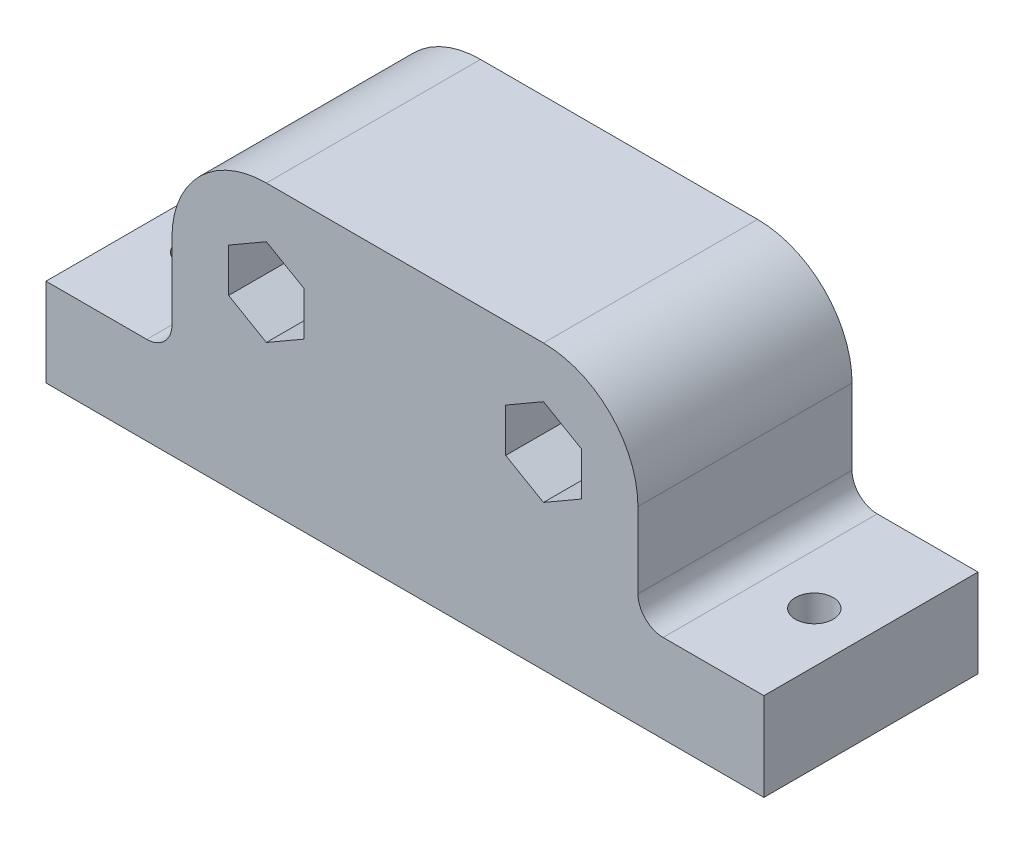
ISO-10303-21;
HEADER;
FILE_DESCRIPTION(('STEP AP214'),'2;1');
FILE_NAME('part.step','',(''),(''),'','','');
FILE_SCHEMA(('AUTOMOTIVE_DESIGN { 1 0 10303 214 1 1 1 1 }'));
ENDSEC;
DATA;
#1=APPLICATION_CONTEXT('core data for automotive mechanical design processes');
#2=APPLICATION_PROTOCOL_DEFINITION('international standard','automotive_design',2000,#1);
#3=PRODUCT_CONTEXT('',#1,'mechanical');
#4=PRODUCT('Part','Part','',(#3));
#5=PRODUCT_RELATED_PRODUCT_CATEGORY('part','',(#4));
#6=PRODUCT_DEFINITION_FORMATION('','',#4);
#7=PRODUCT_DEFINITION_CONTEXT('part definition',#1,'design');
#8=PRODUCT_DEFINITION('design','',#6,#7);
#9=PRODUCT_DEFINITION_SHAPE('','',#8);
#10=(LENGTH_UNIT() NAMED_UNIT(*) SI_UNIT(.MILLI.,.METRE.));
#11=(NAMED_UNIT(*) PLANE_ANGLE_UNIT() SI_UNIT($,.RADIAN.));
#12=(NAMED_UNIT(*) SI_UNIT($,.STERADIAN.) SOLID_ANGLE_UNIT());
#13=UNCERTAINTY_MEASURE_WITH_UNIT(LENGTH_MEASURE(1.E-05),#10,'distance_accuracy_value','');
#14=(GEOMETRIC_REPRESENTATION_CONTEXT(3) GLOBAL_UNCERTAINTY_ASSIGNED_CONTEXT((#13)) GLOBAL_UNIT_ASSIGNED_CONTEXT((#10,
#11,#12)) REPRESENTATION_CONTEXT('',''));
#15=CARTESIAN_POINT('',(0.,0.,0.));
#16=DIRECTION('',(0.,0.,1.));
#17=DIRECTION('',(1.,0.,0.));
#18=AXIS2_PLACEMENT_3D('',#15,#16,#17);
#19=CARTESIAN_POINT('',(6.99999999999999,12.1243556529821,15.));
#20=DIRECTION('',(-0.5,-0.866025403784439,0.));
#21=DIRECTION('',(0.866025403784439,-0.5,0.));
#22=AXIS2_PLACEMENT_3D('',#19,#20,#21);
#23=PLANE('',#22);
#24=DIRECTION('',(-0.866025403784439,0.5,0.));
#25=VECTOR('',#24,1.);
#26=CARTESIAN_POINT('',(6.99999999999999,12.1243556529821,0.));
#27=LINE('',#26,#25);
#28=CARTESIAN_POINT('',(25.,1.73205080756888,0.));
#29=VERTEX_POINT('',#28);
#30=CARTESIAN_POINT('',(22.,3.46410161513776,0.));
#31=VERTEX_POINT('',#30);
#32=EDGE_CURVE('E332',#29,#31,#27,.T.);
#33=ORIENTED_EDGE('',*,*,#32,.F.);
#34=DIRECTION('',(0.,0.,-1.));
#35=VECTOR('',#34,1.);
#36=CARTESIAN_POINT('',(25.,1.73205080756888,15.));
#37=LINE('',#36,#35);
#38=CARTESIAN_POINT('',(25.,1.73205080756888,15.));
#39=VERTEX_POINT('',#38);
#40=EDGE_CURVE('E361',#39,#29,#37,.T.);
#41=ORIENTED_EDGE('',*,*,#40,.F.);
#42=DIRECTION('',(-0.866025403784439,0.5,0.));
#43=VECTOR('',#42,1.);
#44=CARTESIAN_POINT('',(6.99999999999999,12.1243556529821,15.));
#45=LINE('',#44,#43);
#46=CARTESIAN_POINT('',(22.,3.46410161513776,15.));
#47=VERTEX_POINT('',#46);
#48=EDGE_CURVE('E297',#39,#47,#45,.T.);
#49=ORIENTED_EDGE('',*,*,#48,.T.);
#50=DIRECTION('',(0.,0.,-1.));
#51=VECTOR('',#50,1.);
#52=CARTESIAN_POINT('',(22.,3.46410161513776,15.));
#53=LINE('',#52,#51);
#54=EDGE_CURVE('E349',#47,#31,#53,.T.);
#55=ORIENTED_EDGE('',*,*,#54,.T.);
#56=EDGE_LOOP('',(#33,#41,#49,#55));
#57=FACE_BOUND('',#56,.T.);
#58=ADVANCED_FACE('F35',(#57),#23,.T.);
#59=CARTESIAN_POINT('',(25.,0.,15.));
#60=DIRECTION('',(-1.,0.,0.));
#61=DIRECTION('',(0.,-1.,0.));
#62=AXIS2_PLACEMENT_3D('',#59,#60,#61);
#63=PLANE('',#62);
#64=DIRECTION('',(0.,1.,0.));
#65=VECTOR('',#64,1.);
#66=CARTESIAN_POINT('',(25.,0.,0.));
#67=LINE('',#66,#65);
#68=CARTESIAN_POINT('',(25.,-1.73205080756888,0.));
#69=VERTEX_POINT('',#68);
#70=EDGE_CURVE('E335',#69,#29,#67,.T.);
#71=ORIENTED_EDGE('',*,*,#70,.F.);
#72=DIRECTION('',(0.,0.,-1.));
#73=VECTOR('',#72,1.);
#74=CARTESIAN_POINT('',(25.,-1.73205080756888,15.));
#75=LINE('',#74,#73);
#76=CARTESIAN_POINT('',(25.,-1.73205080756888,15.));
#77=VERTEX_POINT('',#76);
#78=EDGE_CURVE('E359',#77,#69,#75,.T.);
#79=ORIENTED_EDGE('',*,*,#78,.F.);
#80=DIRECTION('',(0.,1.,0.));
#81=VECTOR('',#80,1.);
#82=CARTESIAN_POINT('',(25.,0.,15.));
#83=LINE('',#82,#81);
#84=EDGE_CURVE('E300',#77,#39,#83,.T.);
#85=ORIENTED_EDGE('',*,*,#84,.T.);
#86=ORIENTED_EDGE('',*,*,#40,.T.);
#87=EDGE_LOOP('',(#71,#79,#85,#86));
#88=FACE_BOUND('',#87,.T.);
#89=ADVANCED_FACE('F445',(#88),#63,.T.);
#90=CARTESIAN_POINT('',(6.99999999999999,-12.1243556529821,15.));
#91=DIRECTION('',(-0.5,0.866025403784439,0.));
#92=DIRECTION('',(-0.866025403784439,-0.5,0.));
#93=AXIS2_PLACEMENT_3D('',#90,#91,#92);
#94=PLANE('',#93);
#95=DIRECTION('',(0.866025403784439,0.5,0.));
#96=VECTOR('',#95,1.);
#97=CARTESIAN_POINT('',(6.99999999999999,-12.1243556529821,0.));
#98=LINE('',#97,#96);
#99=CARTESIAN_POINT('',(22.,-3.46410161513776,0.));
#100=VERTEX_POINT('',#99);
#101=EDGE_CURVE('E338',#100,#69,#98,.T.);
#102=ORIENTED_EDGE('',*,*,#101,.F.);
#103=DIRECTION('',(0.,0.,-1.));
#104=VECTOR('',#103,1.);
#105=CARTESIAN_POINT('',(22.,-3.46410161513776,15.));
#106=LINE('',#105,#104);
#107=CARTESIAN_POINT('',(22.,-3.46410161513776,15.));
#108=VERTEX_POINT('',#107);
#109=EDGE_CURVE('E357',#108,#100,#106,.T.);
#110=ORIENTED_EDGE('',*,*,#109,.F.);
#111=DIRECTION('',(0.866025403784439,0.5,0.));
#112=VECTOR('',#111,1.);
#113=CARTESIAN_POINT('',(6.99999999999999,-12.1243556529821,15.));
#114=LINE('',#113,#112);
#115=EDGE_CURVE('E303',#108,#77,#114,.T.);
#116=ORIENTED_EDGE('',*,*,#115,.T.);
#117=ORIENTED_EDGE('',*,*,#78,.T.);
#118=EDGE_LOOP('',(#102,#110,#116,#117));
#119=FACE_BOUND('',#118,.T.);
#120=ADVANCED_FACE('F451',(#119),#94,.T.);
#121=CARTESIAN_POINT('',(4.,6.92820323027551,15.));
#122=DIRECTION('',(0.5,0.866025403784439,0.));
#123=DIRECTION('',(-0.866025403784439,0.5,0.));
#124=AXIS2_PLACEMENT_3D('',#121,#122,#123);
#125=PLANE('',#124);
#126=DIRECTION('',(0.866025403784439,-0.5,0.));
#127=VECTOR('',#126,1.);
#128=CARTESIAN_POINT('',(4.,6.92820323027551,0.));
#129=LINE('',#128,#127);
#130=CARTESIAN_POINT('',(19.,-1.73205080756888,0.));
#131=VERTEX_POINT('',#130);
#132=EDGE_CURVE('E341',#131,#100,#129,.T.);
#133=ORIENTED_EDGE('',*,*,#132,.F.);
#134=DIRECTION('',(0.,0.,-1.));
#135=VECTOR('',#134,1.);
#136=CARTESIAN_POINT('',(19.,-1.73205080756888,15.));
#137=LINE('',#136,#135);
#138=CARTESIAN_POINT('',(19.,-1.73205080756888,15.));
#139=VERTEX_POINT('',#138);
#140=EDGE_CURVE('E355',#139,#131,#137,.T.);
#141=ORIENTED_EDGE('',*,*,#140,.F.);
#142=DIRECTION('',(0.866025403784439,-0.5,0.));
#143=VECTOR('',#142,1.);
#144=CARTESIAN_POINT('',(4.,6.92820323027551,15.));
#145=LINE('',#144,#143);
#146=EDGE_CURVE('E306',#139,#108,#145,.T.);
#147=ORIENTED_EDGE('',*,*,#146,.T.);
#148=ORIENTED_EDGE('',*,*,#109,.T.);
#149=EDGE_LOOP('',(#133,#141,#147,#148));
#150=FACE_BOUND('',#149,.T.);
#151=ADVANCED_FACE('F537',(#150),#125,.T.);
#152=CARTESIAN_POINT('',(19.,0.,15.));
#153=DIRECTION('',(1.,0.,0.));
#154=DIRECTION('',(0.,0.,-1.));
#155=AXIS2_PLACEMENT_3D('',#152,#153,#154);
#156=PLANE('',#155);
#157=DIRECTION('',(0.,-1.,0.));
#158=VECTOR('',#157,1.);
#159=CARTESIAN_POINT('',(19.,0.,0.));
#160=LINE('',#159,#158);
#161=CARTESIAN_POINT('',(19.,1.73205080756888,0.));
#162=VERTEX_POINT('',#161);
#163=EDGE_CURVE('E344',#162,#131,#160,.T.);
#164=ORIENTED_EDGE('',*,*,#163,.F.);
#165=DIRECTION('',(0.,0.,-1.));
#166=VECTOR('',#165,1.);
#167=CARTESIAN_POINT('',(19.,1.73205080756888,15.));
#168=LINE('',#167,#166);
#169=CARTESIAN_POINT('',(19.,1.73205080756888,15.));
#170=VERTEX_POINT('',#169);
#171=EDGE_CURVE('E351',#170,#162,#168,.T.);
#172=ORIENTED_EDGE('',*,*,#171,.F.);
#173=DIRECTION('',(0.,-1.,0.));
#174=VECTOR('',#173,1.);
#175=CARTESIAN_POINT('',(19.,0.,15.));
#176=LINE('',#175,#174);
#177=EDGE_CURVE('E309',#170,#139,#176,.T.);
#178=ORIENTED_EDGE('',*,*,#177,.T.);
#179=ORIENTED_EDGE('',*,*,#140,.T.);
#180=EDGE_LOOP('',(#164,#172,#178,#179));
#181=FACE_BOUND('',#180,.T.);
#182=ADVANCED_FACE('F475',(#181),#156,.T.);
#183=CARTESIAN_POINT('',(1.5,2.59807621135332,15.));
#184=DIRECTION('',(-0.5,-0.866025403784439,0.));
#185=DIRECTION('',(0.866025403784439,-0.5,0.));
#186=AXIS2_PLACEMENT_3D('',#183,#184,#185);
#187=PLANE('',#186);
#188=DIRECTION('',(-0.866025403784439,0.5,0.));
#189=VECTOR('',#188,1.);
#190=CARTESIAN_POINT('',(1.5,2.59807621135332,0.));
#191=LINE('',#190,#189);
#192=CARTESIAN_POINT('',(3.,1.73205080756888,0.));
#193=VERTEX_POINT('',#192);
#194=CARTESIAN_POINT('',(0.,3.46410161513776,0.));
#195=VERTEX_POINT('',#194);
#196=EDGE_CURVE('E255',#193,#195,#191,.T.);
#197=ORIENTED_EDGE('',*,*,#196,.F.);
#198=DIRECTION('',(0.,0.,-1.));
#199=VECTOR('',#198,1.);
#200=CARTESIAN_POINT('',(3.,1.73205080756888,15.));
#201=LINE('',#200,#199);
#202=CARTESIAN_POINT('',(3.,1.73205080756888,15.));
#203=VERTEX_POINT('',#202);
#204=EDGE_CURVE('E352',#203,#193,#201,.T.);
#205=ORIENTED_EDGE('',*,*,#204,.F.);
#206=DIRECTION('',(-0.866025403784439,0.5,0.));
#207=VECTOR('',#206,1.);
#208=CARTESIAN_POINT('',(1.5,2.59807621135332,15.));
#209=LINE('',#208,#207);
#210=CARTESIAN_POINT('',(0.,3.46410161513776,15.));
#211=VERTEX_POINT('',#210);
#212=EDGE_CURVE('E279',#203,#211,#209,.T.);
#213=ORIENTED_EDGE('',*,*,#212,.T.);
#214=DIRECTION('',(0.,0.,-1.));
#215=VECTOR('',#214,1.);
#216=CARTESIAN_POINT('',(0.,3.46410161513776,15.));
#217=LINE('',#216,#215);
#218=EDGE_CURVE('E363',#211,#195,#217,.T.);
#219=ORIENTED_EDGE('',*,*,#218,.T.);
#220=EDGE_LOOP('',(#197,#205,#213,#219));
#221=FACE_BOUND('',#220,.T.);
#222=ADVANCED_FACE('F472',(#221),#187,.T.);
#223=CARTESIAN_POINT('',(3.,0.,15.));
#224=DIRECTION('',(-1.,0.,0.));
#225=DIRECTION('',(0.,0.,1.));
#226=AXIS2_PLACEMENT_3D('',#223,#224,#225);
#227=PLANE('',#226);
#228=DIRECTION('',(0.,1.,0.));
#229=VECTOR('',#228,1.);
#230=CARTESIAN_POINT('',(3.,0.,0.));
#231=LINE('',#230,#229);
#232=CARTESIAN_POINT('',(3.,-1.73205080756888,0.));
#233=VERTEX_POINT('',#232);
#234=EDGE_CURVE('E317',#233,#193,#231,.T.);
#235=ORIENTED_EDGE('',*,*,#234,.F.);
#236=DIRECTION('',(0.,0.,-1.));
#237=VECTOR('',#236,1.);
#238=CARTESIAN_POINT('',(3.,-1.73205080756888,15.));
#239=LINE('',#238,#237);
#240=CARTESIAN_POINT('',(3.,-1.73205080756888,15.));
#241=VERTEX_POINT('',#240);
#242=EDGE_CURVE('E373',#241,#233,#239,.T.);
#243=ORIENTED_EDGE('',*,*,#242,.F.);
#244=DIRECTION('',(0.,1.,0.));
#245=VECTOR('',#244,1.);
#246=CARTESIAN_POINT('',(3.,0.,15.));
#247=LINE('',#246,#245);
#248=EDGE_CURVE('E282',#241,#203,#247,.T.);
#249=ORIENTED_EDGE('',*,*,#248,.T.);
#250=ORIENTED_EDGE('',*,*,#204,.T.);
#251=EDGE_LOOP('',(#235,#243,#249,#250));
#252=FACE_BOUND('',#251,.T.);
#253=ADVANCED_FACE('F468',(#252),#227,.T.);
#254=CARTESIAN_POINT('',(1.5,-2.59807621135332,15.));
#255=DIRECTION('',(-0.5,0.866025403784439,0.));
#256=DIRECTION('',(-0.866025403784439,-0.5,0.));
#257=AXIS2_PLACEMENT_3D('',#254,#255,#256);
#258=PLANE('',#257);
#259=DIRECTION('',(0.866025403784439,0.5,0.));
#260=VECTOR('',#259,1.);
#261=CARTESIAN_POINT('',(1.5,-2.59807621135332,0.));
#262=LINE('',#261,#260);
#263=CARTESIAN_POINT('',(0.,-3.46410161513776,0.));
#264=VERTEX_POINT('',#263);
#265=EDGE_CURVE('E320',#264,#233,#262,.T.);
#266=ORIENTED_EDGE('',*,*,#265,.F.);
#267=DIRECTION('',(0.,0.,-1.));
#268=VECTOR('',#267,1.);
#269=CARTESIAN_POINT('',(0.,-3.46410161513776,15.));
#270=LINE('',#269,#268);
#271=CARTESIAN_POINT('',(0.,-3.46410161513776,15.));
#272=VERTEX_POINT('',#271);
#273=EDGE_CURVE('E371',#272,#264,#270,.T.);
#274=ORIENTED_EDGE('',*,*,#273,.F.);
#275=DIRECTION('',(0.866025403784439,0.5,0.));
#276=VECTOR('',#275,1.);
#277=CARTESIAN_POINT('',(1.5,-2.59807621135332,15.));
#278=LINE('',#277,#276);
#279=EDGE_CURVE('E285',#272,#241,#278,.T.);
#280=ORIENTED_EDGE('',*,*,#279,.T.);
#281=ORIENTED_EDGE('',*,*,#242,.T.);
#282=EDGE_LOOP('',(#266,#274,#280,#281));
#283=FACE_BOUND('',#282,.T.);
#284=ADVANCED_FACE('F464',(#283),#258,.T.);
#285=CARTESIAN_POINT('',(-1.5,-2.59807621135332,15.));
#286=DIRECTION('',(0.5,0.866025403784439,0.));
#287=DIRECTION('',(-0.866025403784439,0.5,0.));
#288=AXIS2_PLACEMENT_3D('',#285,#286,#287);
#289=PLANE('',#288);
#290=DIRECTION('',(0.866025403784439,-0.5,0.));
#291=VECTOR('',#290,1.);
#292=CARTESIAN_POINT('',(-1.5,-2.59807621135332,0.));
#293=LINE('',#292,#291);
#294=CARTESIAN_POINT('',(-3.,-1.73205080756888,0.));
#295=VERTEX_POINT('',#294);
#296=EDGE_CURVE('E323',#295,#264,#293,.T.);
#297=ORIENTED_EDGE('',*,*,#296,.F.);
#298=DIRECTION('',(0.,0.,-1.));
#299=VECTOR('',#298,1.);
#300=CARTESIAN_POINT('',(-3.,-1.73205080756888,15.));
#301=LINE('',#300,#299);
#302=CARTESIAN_POINT('',(-3.,-1.73205080756888,15.));
#303=VERTEX_POINT('',#302);
#304=EDGE_CURVE('E369',#303,#295,#301,.T.);
#305=ORIENTED_EDGE('',*,*,#304,.F.);
#306=DIRECTION('',(0.866025403784439,-0.5,0.));
#307=VECTOR('',#306,1.);
#308=CARTESIAN_POINT('',(-1.5,-2.59807621135332,15.));
#309=LINE('',#308,#307);
#310=EDGE_CURVE('E288',#303,#272,#309,.T.);
#311=ORIENTED_EDGE('',*,*,#310,.T.);
#312=ORIENTED_EDGE('',*,*,#273,.T.);
#313=EDGE_LOOP('',(#297,#305,#311,#312));
#314=FACE_BOUND('',#313,.T.);
#315=ADVANCED_FACE('F460',(#314),#289,.T.);
#316=CARTESIAN_POINT('',(-3.,0.,15.));
#317=DIRECTION('',(1.,0.,0.));
#318=DIRECTION('',(0.,0.,-1.));
#319=AXIS2_PLACEMENT_3D('',#316,#317,#318);
#320=PLANE('',#319);
#321=DIRECTION('',(0.,-1.,0.));
#322=VECTOR('',#321,1.);
#323=CARTESIAN_POINT('',(-3.,0.,0.));
#324=LINE('',#323,#322);
#325=CARTESIAN_POINT('',(-3.,1.73205080756888,0.));
#326=VERTEX_POINT('',#325);
#327=EDGE_CURVE('E326',#326,#295,#324,.T.);
#328=ORIENTED_EDGE('',*,*,#327,.F.);
#329=DIRECTION('',(0.,0.,-1.));
#330=VECTOR('',#329,1.);
#331=CARTESIAN_POINT('',(-3.,1.73205080756888,15.));
#332=LINE('',#331,#330);
#333=CARTESIAN_POINT('',(-3.,1.73205080756888,15.));
#334=VERTEX_POINT('',#333);
#335=EDGE_CURVE('E365',#334,#326,#332,.T.);
#336=ORIENTED_EDGE('',*,*,#335,.F.);
#337=DIRECTION('',(0.,-1.,0.));
#338=VECTOR('',#337,1.);
#339=CARTESIAN_POINT('',(-3.,0.,15.));
#340=LINE('',#339,#338);
#341=EDGE_CURVE('E291',#334,#303,#340,.T.);
#342=ORIENTED_EDGE('',*,*,#341,.T.);
#343=ORIENTED_EDGE('',*,*,#304,.T.);
#344=EDGE_LOOP('',(#328,#336,#342,#343));
#345=FACE_BOUND('',#344,.T.);
#346=ADVANCED_FACE('F457',(#345),#320,.T.);
#347=CARTESIAN_POINT('',(29.5,0.,15.));
#348=DIRECTION('',(1.,0.,0.));
#349=DIRECTION('',(0.,0.,-1.));
#350=AXIS2_PLACEMENT_3D('',#347,#348,#349);
#351=PLANE('',#350);
#352=DIRECTION('',(0.,-1.,0.));
#353=VECTOR('',#352,1.);
#354=CARTESIAN_POINT('',(29.5,0.,15.));
#355=LINE('',#354,#353);
#356=CARTESIAN_POINT('',(29.5,0.,15.));
#357=VERTEX_POINT('',#356);
#358=CARTESIAN_POINT('',(29.5,-6.,15.));
#359=VERTEX_POINT('',#358);
#360=EDGE_CURVE('E256',#357,#359,#355,.T.);
#361=ORIENTED_EDGE('',*,*,#360,.T.);
#362=DIRECTION('',(0.,0.,-1.));
#363=VECTOR('',#362,1.);
#364=CARTESIAN_POINT('',(29.5,-6.,15.));
#365=LINE('',#364,#363);
#366=CARTESIAN_POINT('',(29.5,-6.,-2.));
#367=VERTEX_POINT('',#366);
#368=EDGE_CURVE('E205',#359,#367,#365,.T.);
#369=ORIENTED_EDGE('',*,*,#368,.T.);
#370=DIRECTION('',(0.,-1.,0.));
#371=VECTOR('',#370,1.);
#372=CARTESIAN_POINT('',(29.5,0.,-2.));
#373=LINE('',#372,#371);
#374=CARTESIAN_POINT('',(29.5,0.,-2.));
#375=VERTEX_POINT('',#374);
#376=EDGE_CURVE('E222',#375,#367,#373,.T.);
#377=ORIENTED_EDGE('',*,*,#376,.F.);
#378=DIRECTION('',(0.,0.,-1.));
#379=VECTOR('',#378,1.);
#380=CARTESIAN_POINT('',(29.5,0.,15.));
#381=LINE('',#380,#379);
#382=EDGE_CURVE('E366',#357,#375,#381,.T.);
#383=ORIENTED_EDGE('',*,*,#382,.F.);
#384=EDGE_LOOP('',(#361,#369,#377,#383));
#385=FACE_BOUND('',#384,.T.);
#386=ADVANCED_FACE('F396',(#385),#351,.T.);
#387=CARTESIAN_POINT('',(22.,0.,15.));
#388=DIRECTION('',(0.,0.,-1.));
#389=DIRECTION('',(-1.,0.,0.));
#390=AXIS2_PLACEMENT_3D('',#387,#388,#389);
#391=CYLINDRICAL_SURFACE('',#390,7.5);
#392=ORIENTED_EDGE('',*,*,#382,.T.);
#393=CARTESIAN_POINT('',(22.,0.,-2.));
#394=DIRECTION('',(0.,0.,-1.));
#395=DIRECTION('',(-1.,0.,0.));
#396=AXIS2_PLACEMENT_3D('',#393,#394,#395);
#397=CIRCLE('',#396,7.5);
#398=CARTESIAN_POINT('',(22.,7.5,-2.));
#399=VERTEX_POINT('',#398);
#400=EDGE_CURVE('E252',#399,#375,#397,.T.);
#401=ORIENTED_EDGE('',*,*,#400,.F.);
#402=DIRECTION('',(0.,0.,-1.));
#403=VECTOR('',#402,1.);
#404=CARTESIAN_POINT('',(22.,7.5,15.));
#405=LINE('',#404,#403);
#406=CARTESIAN_POINT('',(22.,7.5,15.));
#407=VERTEX_POINT('',#406);
#408=EDGE_CURVE('E387',#407,#399,#405,.T.);
#409=ORIENTED_EDGE('',*,*,#408,.F.);
#410=CARTESIAN_POINT('',(22.,0.,15.));
#411=DIRECTION('',(0.,0.,1.));
#412=DIRECTION('',(1.,0.,0.));
#413=AXIS2_PLACEMENT_3D('',#410,#411,#412);
#414=CIRCLE('',#413,7.5);
#415=EDGE_CURVE('E259',#357,#407,#414,.T.);
#416=ORIENTED_EDGE('',*,*,#415,.F.);
#417=EDGE_LOOP('',(#392,#401,#409,#416));
#418=FACE_BOUND('',#417,.T.);
#419=ADVANCED_FACE('F401',(#418),#391,.T.);
#420=CARTESIAN_POINT('',(0.,7.5,15.));
#421=DIRECTION('',(0.,1.,0.));
#422=DIRECTION('',(-1.,0.,0.));
#423=AXIS2_PLACEMENT_3D('',#420,#421,#422);
#424=PLANE('',#423);
#425=ORIENTED_EDGE('',*,*,#408,.T.);
#426=DIRECTION('',(1.,0.,0.));
#427=VECTOR('',#426,1.);
#428=CARTESIAN_POINT('',(0.,7.5,-2.));
#429=LINE('',#428,#427);
#430=CARTESIAN_POINT('',(0.,7.5,-2.));
#431=VERTEX_POINT('',#430);
#432=EDGE_CURVE('E249',#431,#399,#429,.T.);
#433=ORIENTED_EDGE('',*,*,#432,.F.);
#434=DIRECTION('',(0.,0.,-1.));
#435=VECTOR('',#434,1.);
#436=CARTESIAN_POINT('',(0.,7.5,15.));
#437=LINE('',#436,#435);
#438=CARTESIAN_POINT('',(0.,7.5,15.));
#439=VERTEX_POINT('',#438);
#440=EDGE_CURVE('E385',#439,#431,#437,.T.);
#441=ORIENTED_EDGE('',*,*,#440,.F.);
#442=DIRECTION('',(1.,0.,0.));
#443=VECTOR('',#442,1.);
#444=CARTESIAN_POINT('',(0.,7.5,15.));
#445=LINE('',#444,#443);
#446=EDGE_CURVE('E262',#439,#407,#445,.T.);
#447=ORIENTED_EDGE('',*,*,#446,.T.);
#448=EDGE_LOOP('',(#425,#433,#441,#447));
#449=FACE_BOUND('',#448,.T.);
#450=ADVANCED_FACE('F406',(#449),#424,.T.);
#451=CARTESIAN_POINT('',(0.,0.,15.));
#452=DIRECTION('',(0.,0.,-1.));
#453=DIRECTION('',(-1.,0.,0.));
#454=AXIS2_PLACEMENT_3D('',#451,#452,#453);
#455=CYLINDRICAL_SURFACE('',#454,7.5);
#456=ORIENTED_EDGE('',*,*,#440,.T.);
#457=CARTESIAN_POINT('',(0.,0.,-2.));
#458=DIRECTION('',(0.,0.,-1.));
#459=DIRECTION('',(-1.,0.,0.));
#460=AXIS2_PLACEMENT_3D('',#457,#458,#459);
#461=CIRCLE('',#460,7.5);
#462=CARTESIAN_POINT('',(-7.5,0.,-2.));
#463=VERTEX_POINT('',#462);
#464=EDGE_CURVE('E246',#463,#431,#461,.T.);
#465=ORIENTED_EDGE('',*,*,#464,.F.);
#466=DIRECTION('',(0.,0.,-1.));
#467=VECTOR('',#466,1.);
#468=CARTESIAN_POINT('',(-7.5,0.,15.));
#469=LINE('',#468,#467);
#470=CARTESIAN_POINT('',(-7.5,0.,15.));
#471=VERTEX_POINT('',#470);
#472=EDGE_CURVE('E383',#471,#463,#469,.T.);
#473=ORIENTED_EDGE('',*,*,#472,.F.);
#474=CARTESIAN_POINT('',(0.,0.,15.));
#475=DIRECTION('',(0.,0.,1.));
#476=DIRECTION('',(1.,0.,0.));
#477=AXIS2_PLACEMENT_3D('',#474,#475,#476);
#478=CIRCLE('',#477,7.5);
#479=EDGE_CURVE('E265',#439,#471,#478,.T.);
#480=ORIENTED_EDGE('',*,*,#479,.F.);
#481=EDGE_LOOP('',(#456,#465,#473,#480));
#482=FACE_BOUND('',#481,.T.);
#483=ADVANCED_FACE('F410',(#482),#455,.T.);
#484=CARTESIAN_POINT('',(-7.5,0.,15.));
#485=DIRECTION('',(1.,0.,0.));
#486=DIRECTION('',(0.,1.,0.));
#487=AXIS2_PLACEMENT_3D('',#484,#485,#486);
#488=PLANE('',#487);
#489=ORIENTED_EDGE('',*,*,#472,.T.);
#490=DIRECTION('',(0.,1.,0.));
#491=VECTOR('',#490,1.);
#492=CARTESIAN_POINT('',(-7.5,-6.,-2.));
#493=LINE('',#492,#491);
#494=CARTESIAN_POINT('',(-7.5,-6.,-2.));
#495=VERTEX_POINT('',#494);
#496=EDGE_CURVE('E243',#495,#463,#493,.T.);
#497=ORIENTED_EDGE('',*,*,#496,.F.);
#498=DIRECTION('',(0.,0.,-1.));
#499=VECTOR('',#498,1.);
#500=CARTESIAN_POINT('',(-7.5,-6.,15.));
#501=LINE('',#500,#499);
#502=CARTESIAN_POINT('',(-7.5,-6.,15.));
#503=VERTEX_POINT('',#502);
#504=EDGE_CURVE('E50',#495,#503,#501,.F.);
#505=ORIENTED_EDGE('',*,*,#504,.T.);
#506=DIRECTION('',(0.,-1.,0.));
#507=VECTOR('',#506,1.);
#508=CARTESIAN_POINT('',(-7.5,0.,15.));
#509=LINE('',#508,#507);
#510=EDGE_CURVE('E267',#471,#503,#509,.T.);
#511=ORIENTED_EDGE('',*,*,#510,.F.);
#512=EDGE_LOOP('',(#489,#497,#505,#511));
#513=FACE_BOUND('',#512,.T.);
#514=ADVANCED_FACE('F411',(#513),#488,.F.);
#515=CARTESIAN_POINT('',(0.,-8.,15.));
#516=DIRECTION('',(0.,-1.,0.));
#517=DIRECTION('',(1.,0.,0.));
#518=AXIS2_PLACEMENT_3D('',#515,#516,#517);
#519=PLANE('',#518);
#520=CARTESIAN_POINT('',(-13.5,-8.,7.));
#521=DIRECTION('',(0.,1.,0.));
#522=DIRECTION('',(-1.,0.,0.));
#523=AXIS2_PLACEMENT_3D('',#520,#521,#522);
#524=CIRCLE('',#523,1.5);
#525=CARTESIAN_POINT('',(-15.,-8.,7.));
#526=VERTEX_POINT('',#525);
#527=EDGE_CURVE('E492',#526,#526,#524,.T.);
#528=ORIENTED_EDGE('',*,*,#527,.F.);
#529=EDGE_LOOP('',(#528));
#530=FACE_BOUND('',#529,.T.);
#531=DIRECTION('',(-1.,0.,0.));
#532=VECTOR('',#531,1.);
#533=CARTESIAN_POINT('',(0.,-8.,15.));
#534=LINE('',#533,#532);
#535=CARTESIAN_POINT('',(-9.5,-8.,15.));
#536=VERTEX_POINT('',#535);
#537=CARTESIAN_POINT('',(-17.5,-8.,15.));
#538=VERTEX_POINT('',#537);
#539=EDGE_CURVE('E269',#536,#538,#534,.T.);
#540=ORIENTED_EDGE('',*,*,#539,.F.);
#541=DIRECTION('',(0.,0.,-1.));
#542=VECTOR('',#541,1.);
#543=CARTESIAN_POINT('',(-9.5,-8.,0.));
#544=LINE('',#543,#542);
#545=CARTESIAN_POINT('',(-9.5,-8.,-2.));
#546=VERTEX_POINT('',#545);
#547=EDGE_CURVE('E204',#536,#546,#544,.T.);
#548=ORIENTED_EDGE('',*,*,#547,.T.);
#549=DIRECTION('',(1.,0.,0.));
#550=VECTOR('',#549,1.);
#551=CARTESIAN_POINT('',(-17.5,-8.,-2.));
#552=LINE('',#551,#550);
#553=CARTESIAN_POINT('',(-17.5,-8.,-2.));
#554=VERTEX_POINT('',#553);
#555=EDGE_CURVE('E237',#554,#546,#552,.T.);
#556=ORIENTED_EDGE('',*,*,#555,.F.);
#557=DIRECTION('',(0.,0.,-1.));
#558=VECTOR('',#557,1.);
#559=CARTESIAN_POINT('',(-17.5,-8.,15.));
#560=LINE('',#559,#558);
#561=EDGE_CURVE('E381',#538,#554,#560,.T.);
#562=ORIENTED_EDGE('',*,*,#561,.F.);
#563=EDGE_LOOP('',(#540,#548,#556,#562));
#564=FACE_BOUND('',#563,.T.);
#565=ADVANCED_FACE('F417',(#530,#564),#519,.F.);
#566=CARTESIAN_POINT('',(-17.5,0.,15.));
#567=DIRECTION('',(1.,0.,0.));
#568=DIRECTION('',(0.,0.,-1.));
#569=AXIS2_PLACEMENT_3D('',#566,#567,#568);
#570=PLANE('',#569);
#571=ORIENTED_EDGE('',*,*,#561,.T.);
#572=DIRECTION('',(0.,1.,0.));
#573=VECTOR('',#572,1.);
#574=CARTESIAN_POINT('',(-17.5,-15.,-2.));
#575=LINE('',#574,#573);
#576=CARTESIAN_POINT('',(-17.5,-15.,-2.));
#577=VERTEX_POINT('',#576);
#578=EDGE_CURVE('E234',#577,#554,#575,.T.);
#579=ORIENTED_EDGE('',*,*,#578,.F.);
#580=DIRECTION('',(0.,0.,-1.));
#581=VECTOR('',#580,1.);
#582=CARTESIAN_POINT('',(-17.5,-15.,15.));
#583=LINE('',#582,#581);
#584=CARTESIAN_POINT('',(-17.5,-15.,15.));
#585=VERTEX_POINT('',#584);
#586=EDGE_CURVE('E379',#585,#577,#583,.T.);
#587=ORIENTED_EDGE('',*,*,#586,.F.);
#588=DIRECTION('',(0.,-1.,0.));
#589=VECTOR('',#588,1.);
#590=CARTESIAN_POINT('',(-17.5,0.,15.));
#591=LINE('',#590,#589);
#592=EDGE_CURVE('E271',#538,#585,#591,.T.);
#593=ORIENTED_EDGE('',*,*,#592,.F.);
#594=EDGE_LOOP('',(#571,#579,#587,#593));
#595=FACE_BOUND('',#594,.T.);
#596=ADVANCED_FACE('F423',(#595),#570,.F.);
#597=CARTESIAN_POINT('',(0.,-15.,15.));
#598=DIRECTION('',(0.,1.,0.));
#599=DIRECTION('',(0.,0.,1.));
#600=AXIS2_PLACEMENT_3D('',#597,#598,#599);
#601=PLANE('',#600);
#602=CARTESIAN_POINT('',(35.5,-15.,7.));
#603=DIRECTION('',(0.,1.,0.));
#604=DIRECTION('',(-1.,0.,0.));
#605=AXIS2_PLACEMENT_3D('',#602,#603,#604);
#606=CIRCLE('',#605,1.5);
#607=CARTESIAN_POINT('',(34.,-15.,7.));
#608=VERTEX_POINT('',#607);
#609=EDGE_CURVE('E489',#608,#608,#606,.T.);
#610=ORIENTED_EDGE('',*,*,#609,.T.);
#611=EDGE_LOOP('',(#610));
#612=FACE_BOUND('',#611,.T.);
#613=CARTESIAN_POINT('',(-13.5,-15.,7.));
#614=DIRECTION('',(0.,1.,0.));
#615=DIRECTION('',(-1.,0.,0.));
#616=AXIS2_PLACEMENT_3D('',#613,#614,#615);
#617=CIRCLE('',#616,1.5);
#618=CARTESIAN_POINT('',(-15.,-15.,7.));
#619=VERTEX_POINT('',#618);
#620=EDGE_CURVE('E495',#619,#619,#617,.T.);
#621=ORIENTED_EDGE('',*,*,#620,.T.);
#622=EDGE_LOOP('',(#621));
#623=FACE_BOUND('',#622,.T.);
#624=ORIENTED_EDGE('',*,*,#586,.T.);
#625=DIRECTION('',(-1.,0.,0.));
#626=VECTOR('',#625,1.);
#627=CARTESIAN_POINT('',(39.5,-15.,-2.));
#628=LINE('',#627,#626);
#629=CARTESIAN_POINT('',(39.5,-15.,-2.));
#630=VERTEX_POINT('',#629);
#631=EDGE_CURVE('E231',#630,#577,#628,.T.);
#632=ORIENTED_EDGE('',*,*,#631,.F.);
#633=DIRECTION('',(0.,0.,-1.));
#634=VECTOR('',#633,1.);
#635=CARTESIAN_POINT('',(39.5,-15.,15.));
#636=LINE('',#635,#634);
#637=CARTESIAN_POINT('',(39.5,-15.,15.));
#638=VERTEX_POINT('',#637);
#639=EDGE_CURVE('E377',#638,#630,#636,.T.);
#640=ORIENTED_EDGE('',*,*,#639,.F.);
#641=DIRECTION('',(1.,0.,0.));
#642=VECTOR('',#641,1.);
#643=CARTESIAN_POINT('',(0.,-15.,15.));
#644=LINE('',#643,#642);
#645=EDGE_CURVE('E273',#585,#638,#644,.T.);
#646=ORIENTED_EDGE('',*,*,#645,.F.);
#647=EDGE_LOOP('',(#624,#632,#640,#646));
#648=FACE_BOUND('',#647,.T.);
#649=ADVANCED_FACE('F429',(#612,#623,#648),#601,.F.);
#650=CARTESIAN_POINT('',(39.5,0.,15.));
#651=DIRECTION('',(-1.,0.,0.));
#652=DIRECTION('',(0.,-1.,0.));
#653=AXIS2_PLACEMENT_3D('',#650,#651,#652);
#654=PLANE('',#653);
#655=ORIENTED_EDGE('',*,*,#639,.T.);
#656=DIRECTION('',(0.,-1.,0.));
#657=VECTOR('',#656,1.);
#658=CARTESIAN_POINT('',(39.5,-7.99999999999999,-2.));
#659=LINE('',#658,#657);
#660=CARTESIAN_POINT('',(39.5,-7.99999999999999,-2.));
#661=VERTEX_POINT('',#660);
#662=EDGE_CURVE('E215',#661,#630,#659,.T.);
#663=ORIENTED_EDGE('',*,*,#662,.F.);
#664=DIRECTION('',(0.,0.,-1.));
#665=VECTOR('',#664,1.);
#666=CARTESIAN_POINT('',(39.5,-7.99999999999999,15.));
#667=LINE('',#666,#665);
#668=CARTESIAN_POINT('',(39.5,-7.99999999999999,15.));
#669=VERTEX_POINT('',#668);
#670=EDGE_CURVE('E211',#669,#661,#667,.T.);
#671=ORIENTED_EDGE('',*,*,#670,.F.);
#672=DIRECTION('',(0.,1.,0.));
#673=VECTOR('',#672,1.);
#674=CARTESIAN_POINT('',(39.5,0.,15.));
#675=LINE('',#674,#673);
#676=EDGE_CURVE('E275',#638,#669,#675,.T.);
#677=ORIENTED_EDGE('',*,*,#676,.F.);
#678=EDGE_LOOP('',(#655,#663,#671,#677));
#679=FACE_BOUND('',#678,.T.);
#680=ADVANCED_FACE('F431',(#679),#654,.F.);
#681=CARTESIAN_POINT('',(-1.5,2.59807621135332,15.));
#682=DIRECTION('',(0.5,-0.866025403784439,0.));
#683=DIRECTION('',(0.866025403784439,0.5,0.));
#684=AXIS2_PLACEMENT_3D('',#681,#682,#683);
#685=PLANE('',#684);
#686=DIRECTION('',(-0.866025403784439,-0.5,0.));
#687=VECTOR('',#686,1.);
#688=CARTESIAN_POINT('',(-1.5,2.59807621135332,0.));
#689=LINE('',#688,#687);
#690=EDGE_CURVE('E329',#195,#326,#689,.T.);
#691=ORIENTED_EDGE('',*,*,#690,.F.);
#692=ORIENTED_EDGE('',*,*,#218,.F.);
#693=DIRECTION('',(-0.866025403784439,-0.5,0.));
#694=VECTOR('',#693,1.);
#695=CARTESIAN_POINT('',(-1.5,2.59807621135332,15.));
#696=LINE('',#695,#694);
#697=EDGE_CURVE('E294',#211,#334,#696,.T.);
#698=ORIENTED_EDGE('',*,*,#697,.T.);
#699=ORIENTED_EDGE('',*,*,#335,.T.);
#700=EDGE_LOOP('',(#691,#692,#698,#699));
#701=FACE_BOUND('',#700,.T.);
#702=ADVANCED_FACE('F433',(#701),#685,.T.);
#703=CARTESIAN_POINT('',(0.,-8.00000000000001,15.));
#704=DIRECTION('',(0.,-1.,0.));
#705=DIRECTION('',(1.,0.,0.));
#706=AXIS2_PLACEMENT_3D('',#703,#704,#705);
#707=PLANE('',#706);
#708=CARTESIAN_POINT('',(35.5,-7.99999999999999,7.));
#709=DIRECTION('',(0.,1.,0.));
#710=DIRECTION('',(-1.,0.,0.));
#711=AXIS2_PLACEMENT_3D('',#708,#709,#710);
#712=CIRCLE('',#711,1.5);
#713=CARTESIAN_POINT('',(34.,-7.99999999999999,7.));
#714=VERTEX_POINT('',#713);
#715=EDGE_CURVE('E487',#714,#714,#712,.T.);
#716=ORIENTED_EDGE('',*,*,#715,.F.);
#717=EDGE_LOOP('',(#716));
#718=FACE_BOUND('',#717,.T.);
#719=ORIENTED_EDGE('',*,*,#670,.T.);
#720=DIRECTION('',(1.,0.,0.));
#721=VECTOR('',#720,1.);
#722=CARTESIAN_POINT('',(31.5,-8.,-2.));
#723=LINE('',#722,#721);
#724=CARTESIAN_POINT('',(31.5,-8.,-2.));
#725=VERTEX_POINT('',#724);
#726=EDGE_CURVE('E208',#725,#661,#723,.T.);
#727=ORIENTED_EDGE('',*,*,#726,.F.);
#728=DIRECTION('',(0.,0.,-1.));
#729=VECTOR('',#728,1.);
#730=CARTESIAN_POINT('',(31.5,-8.,15.));
#731=LINE('',#730,#729);
#732=CARTESIAN_POINT('',(31.5,-8.,15.));
#733=VERTEX_POINT('',#732);
#734=EDGE_CURVE('E195',#725,#733,#731,.F.);
#735=ORIENTED_EDGE('',*,*,#734,.T.);
#736=DIRECTION('',(-1.,0.,0.));
#737=VECTOR('',#736,1.);
#738=CARTESIAN_POINT('',(0.,-8.00000000000001,15.));
#739=LINE('',#738,#737);
#740=EDGE_CURVE('E277',#669,#733,#739,.T.);
#741=ORIENTED_EDGE('',*,*,#740,.F.);
#742=EDGE_LOOP('',(#719,#727,#735,#741));
#743=FACE_BOUND('',#742,.T.);
#744=ADVANCED_FACE('F209',(#718,#743),#707,.F.);
#745=CARTESIAN_POINT('',(3.99999999999999,-6.9282032302755,15.));
#746=DIRECTION('',(0.5,-0.866025403784439,0.));
#747=DIRECTION('',(0.866025403784439,0.5,0.));
#748=AXIS2_PLACEMENT_3D('',#745,#746,#747);
#749=PLANE('',#748);
#750=DIRECTION('',(-0.866025403784439,-0.5,0.));
#751=VECTOR('',#750,1.);
#752=CARTESIAN_POINT('',(3.99999999999999,-6.9282032302755,0.));
#753=LINE('',#752,#751);
#754=EDGE_CURVE('E260',#31,#162,#753,.T.);
#755=ORIENTED_EDGE('',*,*,#754,.F.);
#756=ORIENTED_EDGE('',*,*,#54,.F.);
#757=DIRECTION('',(-0.866025403784439,-0.5,0.));
#758=VECTOR('',#757,1.);
#759=CARTESIAN_POINT('',(3.99999999999999,-6.9282032302755,15.));
#760=LINE('',#759,#758);
#761=EDGE_CURVE('E312',#47,#170,#760,.T.);
#762=ORIENTED_EDGE('',*,*,#761,.T.);
#763=ORIENTED_EDGE('',*,*,#171,.T.);
#764=EDGE_LOOP('',(#755,#756,#762,#763));
#765=FACE_BOUND('',#764,.T.);
#766=ADVANCED_FACE('F478',(#765),#749,.T.);
#767=CARTESIAN_POINT('',(0.,0.,15.));
#768=DIRECTION('',(0.,0.,1.));
#769=DIRECTION('',(1.,0.,0.));
#770=AXIS2_PLACEMENT_3D('',#767,#768,#769);
#771=PLANE('',#770);
#772=ORIENTED_EDGE('',*,*,#360,.F.);
#773=ORIENTED_EDGE('',*,*,#415,.T.);
#774=ORIENTED_EDGE('',*,*,#446,.F.);
#775=ORIENTED_EDGE('',*,*,#479,.T.);
#776=ORIENTED_EDGE('',*,*,#510,.T.);
#777=CARTESIAN_POINT('',(-9.5,-6.,15.));
#778=DIRECTION('',(0.,0.,1.));
#779=DIRECTION('',(1.,0.,0.));
#780=AXIS2_PLACEMENT_3D('',#777,#778,#779);
#781=CIRCLE('',#780,2.);
#782=EDGE_CURVE('E11',#503,#536,#781,.F.);
#783=ORIENTED_EDGE('',*,*,#782,.T.);
#784=ORIENTED_EDGE('',*,*,#539,.T.);
#785=ORIENTED_EDGE('',*,*,#592,.T.);
#786=ORIENTED_EDGE('',*,*,#645,.T.);
#787=ORIENTED_EDGE('',*,*,#676,.T.);
#788=ORIENTED_EDGE('',*,*,#740,.T.);
#789=CARTESIAN_POINT('',(31.5,-6.,15.));
#790=DIRECTION('',(0.,0.,1.));
#791=DIRECTION('',(1.,0.,0.));
#792=AXIS2_PLACEMENT_3D('',#789,#790,#791);
#793=CIRCLE('',#792,2.);
#794=EDGE_CURVE('E43',#733,#359,#793,.F.);
#795=ORIENTED_EDGE('',*,*,#794,.T.);
#796=EDGE_LOOP('',(#772,#773,#774,#775,#776,#783,#784,#785,#786,#787,#788,#795));
#797=FACE_BOUND('',#796,.T.);
#798=ORIENTED_EDGE('',*,*,#212,.F.);
#799=ORIENTED_EDGE('',*,*,#248,.F.);
#800=ORIENTED_EDGE('',*,*,#279,.F.);
#801=ORIENTED_EDGE('',*,*,#310,.F.);
#802=ORIENTED_EDGE('',*,*,#341,.F.);
#803=ORIENTED_EDGE('',*,*,#697,.F.);
#804=EDGE_LOOP('',(#798,#799,#800,#801,#802,#803));
#805=FACE_BOUND('',#804,.T.);
#806=ORIENTED_EDGE('',*,*,#48,.F.);
#807=ORIENTED_EDGE('',*,*,#84,.F.);
#808=ORIENTED_EDGE('',*,*,#115,.F.);
#809=ORIENTED_EDGE('',*,*,#146,.F.);
#810=ORIENTED_EDGE('',*,*,#177,.F.);
#811=ORIENTED_EDGE('',*,*,#761,.F.);
#812=EDGE_LOOP('',(#806,#807,#808,#809,#810,#811));
#813=FACE_BOUND('',#812,.T.);
#814=ADVANCED_FACE('F393',(#797,#805,#813),#771,.T.);
#815=CARTESIAN_POINT('',(31.5,-6.,15.));
#816=DIRECTION('',(0.,0.,-1.));
#817=DIRECTION('',(-1.,0.,0.));
#818=AXIS2_PLACEMENT_3D('',#815,#816,#817);
#819=CYLINDRICAL_SURFACE('',#818,2.);
#820=ORIENTED_EDGE('',*,*,#794,.F.);
#821=ORIENTED_EDGE('',*,*,#734,.F.);
#822=CARTESIAN_POINT('',(31.5,-6.,-2.));
#823=DIRECTION('',(0.,0.,1.));
#824=DIRECTION('',(-1.,0.,0.));
#825=AXIS2_PLACEMENT_3D('',#822,#823,#824);
#826=CIRCLE('',#825,2.);
#827=EDGE_CURVE('E200',#367,#725,#826,.T.);
#828=ORIENTED_EDGE('',*,*,#827,.F.);
#829=ORIENTED_EDGE('',*,*,#368,.F.);
#830=EDGE_LOOP('',(#820,#821,#828,#829));
#831=FACE_BOUND('',#830,.T.);
#832=ADVANCED_FACE('F197',(#831),#819,.F.);
#833=CARTESIAN_POINT('',(-9.5,-6.,15.));
#834=DIRECTION('',(0.,0.,1.));
#835=DIRECTION('',(1.,0.,0.));
#836=AXIS2_PLACEMENT_3D('',#833,#834,#835);
#837=CYLINDRICAL_SURFACE('',#836,2.);
#838=ORIENTED_EDGE('',*,*,#782,.F.);
#839=ORIENTED_EDGE('',*,*,#504,.F.);
#840=CARTESIAN_POINT('',(-9.5,-6.,-2.));
#841=DIRECTION('',(0.,0.,1.));
#842=DIRECTION('',(-1.,0.,0.));
#843=AXIS2_PLACEMENT_3D('',#840,#841,#842);
#844=CIRCLE('',#843,2.);
#845=EDGE_CURVE('E240',#546,#495,#844,.T.);
#846=ORIENTED_EDGE('',*,*,#845,.F.);
#847=ORIENTED_EDGE('',*,*,#547,.F.);
#848=EDGE_LOOP('',(#838,#839,#846,#847));
#849=FACE_BOUND('',#848,.T.);
#850=ADVANCED_FACE('F37',(#849),#837,.F.);
#851=CARTESIAN_POINT('',(31.5,-6.,0.));
#852=DIRECTION('',(0.,0.,-1.));
#853=DIRECTION('',(-1.,0.,0.));
#854=AXIS2_PLACEMENT_3D('',#851,#852,#853);
#855=PLANE('',#854);
#856=ORIENTED_EDGE('',*,*,#196,.T.);
#857=ORIENTED_EDGE('',*,*,#690,.T.);
#858=ORIENTED_EDGE('',*,*,#327,.T.);
#859=ORIENTED_EDGE('',*,*,#296,.T.);
#860=ORIENTED_EDGE('',*,*,#265,.T.);
#861=ORIENTED_EDGE('',*,*,#234,.T.);
#862=EDGE_LOOP('',(#856,#857,#858,#859,#860,#861));
#863=FACE_BOUND('',#862,.T.);
#864=CARTESIAN_POINT('',(0.,0.,0.));
#865=DIRECTION('',(0.,0.,-1.));
#866=DIRECTION('',(-1.,0.,0.));
#867=AXIS2_PLACEMENT_3D('',#864,#865,#866);
#868=CIRCLE('',#867,2.5);
#869=CARTESIAN_POINT('',(-2.5,0.,0.));
#870=VERTEX_POINT('',#869);
#871=EDGE_CURVE('E498',#870,#870,#868,.T.);
#872=ORIENTED_EDGE('',*,*,#871,.T.);
#873=EDGE_LOOP('',(#872));
#874=FACE_BOUND('',#873,.T.);
#875=ADVANCED_FACE('F507',(#863,#874),#855,.F.);
#876=CARTESIAN_POINT('',(31.5,-6.,-2.));
#877=DIRECTION('',(0.,0.,-1.));
#878=DIRECTION('',(-1.,0.,0.));
#879=AXIS2_PLACEMENT_3D('',#876,#877,#878);
#880=PLANE('',#879);
#881=CARTESIAN_POINT('',(22.,0.,-2.));
#882=DIRECTION('',(0.,0.,-1.));
#883=DIRECTION('',(-1.,0.,0.));
#884=AXIS2_PLACEMENT_3D('',#881,#882,#883);
#885=CIRCLE('',#884,2.5);
#886=CARTESIAN_POINT('',(19.5,0.,-2.));
#887=VERTEX_POINT('',#886);
#888=EDGE_CURVE('E223',#887,#887,#885,.T.);
#889=ORIENTED_EDGE('',*,*,#888,.F.);
#890=EDGE_LOOP('',(#889));
#891=FACE_BOUND('',#890,.T.);
#892=ORIENTED_EDGE('',*,*,#827,.T.);
#893=ORIENTED_EDGE('',*,*,#726,.T.);
#894=ORIENTED_EDGE('',*,*,#662,.T.);
#895=ORIENTED_EDGE('',*,*,#631,.T.);
#896=ORIENTED_EDGE('',*,*,#578,.T.);
#897=ORIENTED_EDGE('',*,*,#555,.T.);
#898=ORIENTED_EDGE('',*,*,#845,.T.);
#899=ORIENTED_EDGE('',*,*,#496,.T.);
#900=ORIENTED_EDGE('',*,*,#464,.T.);
#901=ORIENTED_EDGE('',*,*,#432,.T.);
#902=ORIENTED_EDGE('',*,*,#400,.T.);
#903=ORIENTED_EDGE('',*,*,#376,.T.);
#904=EDGE_LOOP('',(#892,#893,#894,#895,#896,#897,#898,#899,#900,#901,#902,#903));
#905=FACE_BOUND('',#904,.T.);
#906=CARTESIAN_POINT('',(0.,0.,-2.));
#907=DIRECTION('',(0.,0.,-1.));
#908=DIRECTION('',(-1.,0.,0.));
#909=AXIS2_PLACEMENT_3D('',#906,#907,#908);
#910=CIRCLE('',#909,2.5);
#911=CARTESIAN_POINT('',(-2.5,0.,-2.));
#912=VERTEX_POINT('',#911);
#913=EDGE_CURVE('E501',#912,#912,#910,.T.);
#914=ORIENTED_EDGE('',*,*,#913,.F.);
#915=EDGE_LOOP('',(#914));
#916=FACE_BOUND('',#915,.T.);
#917=ADVANCED_FACE('F218',(#891,#905,#916),#880,.T.);
#918=ORIENTED_EDGE('',*,*,#32,.T.);
#919=ORIENTED_EDGE('',*,*,#754,.T.);
#920=ORIENTED_EDGE('',*,*,#163,.T.);
#921=ORIENTED_EDGE('',*,*,#132,.T.);
#922=ORIENTED_EDGE('',*,*,#101,.T.);
#923=ORIENTED_EDGE('',*,*,#70,.T.);
#924=EDGE_LOOP('',(#918,#919,#920,#921,#922,#923));
#925=FACE_BOUND('',#924,.T.);
#926=CARTESIAN_POINT('',(22.,0.,0.));
#927=DIRECTION('',(0.,0.,-1.));
#928=DIRECTION('',(-1.,0.,0.));
#929=AXIS2_PLACEMENT_3D('',#926,#927,#928);
#930=CIRCLE('',#929,2.5);
#931=CARTESIAN_POINT('',(19.5,0.,0.));
#932=VERTEX_POINT('',#931);
#933=EDGE_CURVE('E226',#932,#932,#930,.T.);
#934=ORIENTED_EDGE('',*,*,#933,.T.);
#935=EDGE_LOOP('',(#934));
#936=FACE_BOUND('',#935,.T.);
#937=ADVANCED_FACE('F522',(#925,#936),#855,.F.);
#938=CARTESIAN_POINT('',(22.,0.,-2.));
#939=DIRECTION('',(0.,0.,1.));
#940=DIRECTION('',(1.,0.,0.));
#941=AXIS2_PLACEMENT_3D('',#938,#939,#940);
#942=CYLINDRICAL_SURFACE('',#941,2.5);
#943=ORIENTED_EDGE('',*,*,#888,.T.);
#944=EDGE_LOOP('',(#943));
#945=FACE_BOUND('',#944,.T.);
#946=ORIENTED_EDGE('',*,*,#933,.F.);
#947=EDGE_LOOP('',(#946));
#948=FACE_BOUND('',#947,.T.);
#949=ADVANCED_FACE('F512',(#945,#948),#942,.F.);
#950=CARTESIAN_POINT('',(0.,0.,-2.));
#951=DIRECTION('',(0.,0.,1.));
#952=DIRECTION('',(1.,0.,0.));
#953=AXIS2_PLACEMENT_3D('',#950,#951,#952);
#954=CYLINDRICAL_SURFACE('',#953,2.5);
#955=ORIENTED_EDGE('',*,*,#913,.T.);
#956=EDGE_LOOP('',(#955));
#957=FACE_BOUND('',#956,.T.);
#958=ORIENTED_EDGE('',*,*,#871,.F.);
#959=EDGE_LOOP('',(#958));
#960=FACE_BOUND('',#959,.T.);
#961=ADVANCED_FACE('F509',(#957,#960),#954,.F.);
#962=CARTESIAN_POINT('',(-13.5,-15.,7.));
#963=DIRECTION('',(0.,1.,0.));
#964=DIRECTION('',(-1.,0.,0.));
#965=AXIS2_PLACEMENT_3D('',#962,#963,#964);
#966=CYLINDRICAL_SURFACE('',#965,1.5);
#967=ORIENTED_EDGE('',*,*,#620,.F.);
#968=EDGE_LOOP('',(#967));
#969=FACE_BOUND('',#968,.T.);
#970=ORIENTED_EDGE('',*,*,#527,.T.);
#971=EDGE_LOOP('',(#970));
#972=FACE_BOUND('',#971,.T.);
#973=ADVANCED_FACE('F511',(#969,#972),#966,.F.);
#974=CARTESIAN_POINT('',(35.5,-15.,7.));
#975=DIRECTION('',(0.,1.,0.));
#976=DIRECTION('',(-1.,0.,0.));
#977=AXIS2_PLACEMENT_3D('',#974,#975,#976);
#978=CYLINDRICAL_SURFACE('',#977,1.5);
#979=ORIENTED_EDGE('',*,*,#609,.F.);
#980=EDGE_LOOP('',(#979));
#981=FACE_BOUND('',#980,.T.);
#982=ORIENTED_EDGE('',*,*,#715,.T.);
#983=EDGE_LOOP('',(#982));
#984=FACE_BOUND('',#983,.T.);
#985=ADVANCED_FACE('F519',(#981,#984),#978,.F.);
#986=CLOSED_SHELL('',(#58,#89,#120,#151,#182,#222,#253,#284,#315,#346,#386,#419,#450,#483,#514,
#565,#596,#649,#680,#702,#744,#766,#814,#832,#850,#875,#917,#937,#949,#961,#973,#985));
#987=MANIFOLD_SOLID_BREP('B2',#986);
#988=ADVANCED_BREP_SHAPE_REPRESENTATION('',(#18,#987),#14);
#989=SHAPE_DEFINITION_REPRESENTATION(#9,#988);
ENDSEC;
END-ISO-10303-21;
